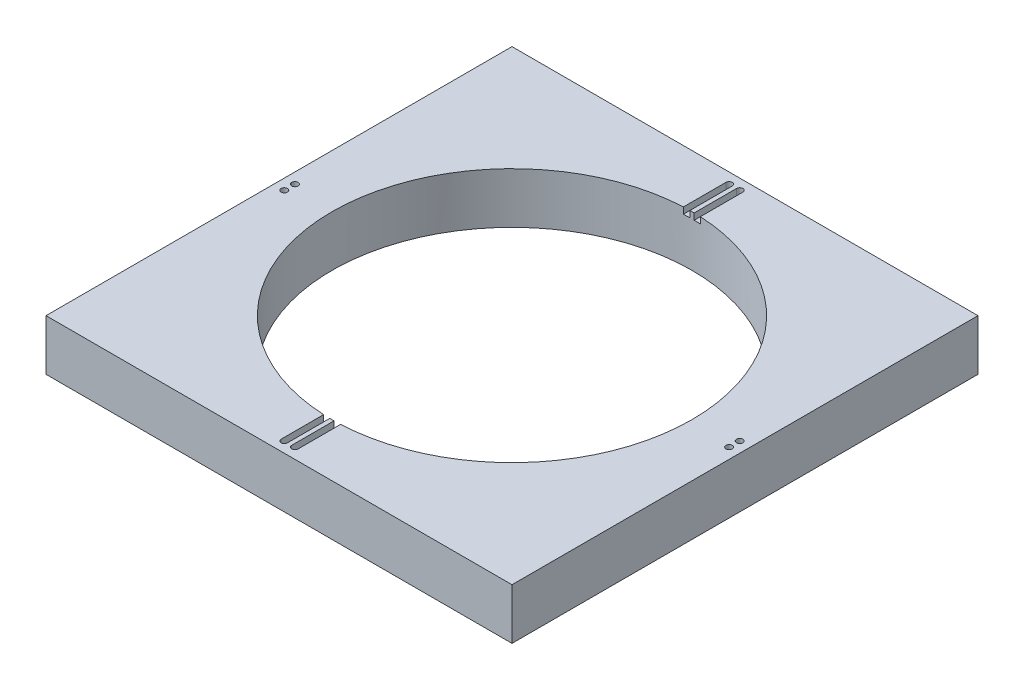
ISO-10303-21;
HEADER;
FILE_DESCRIPTION(('STEP AP214'),'2;1');
FILE_NAME('part.step','',(''),(''),'','','');
FILE_SCHEMA(('AUTOMOTIVE_DESIGN { 1 0 10303 214 1 1 1 1 }'));
ENDSEC;
DATA;
#1=APPLICATION_CONTEXT('core data for automotive mechanical design processes');
#2=APPLICATION_PROTOCOL_DEFINITION('international standard','automotive_design',2000,#1);
#3=PRODUCT_CONTEXT('',#1,'mechanical');
#4=PRODUCT('Part','Part','',(#3));
#5=PRODUCT_RELATED_PRODUCT_CATEGORY('part','',(#4));
#6=PRODUCT_DEFINITION_FORMATION('','',#4);
#7=PRODUCT_DEFINITION_CONTEXT('part definition',#1,'design');
#8=PRODUCT_DEFINITION('design','',#6,#7);
#9=PRODUCT_DEFINITION_SHAPE('','',#8);
#10=(LENGTH_UNIT() NAMED_UNIT(*) SI_UNIT(.MILLI.,.METRE.));
#11=(NAMED_UNIT(*) PLANE_ANGLE_UNIT() SI_UNIT($,.RADIAN.));
#12=(NAMED_UNIT(*) SI_UNIT($,.STERADIAN.) SOLID_ANGLE_UNIT());
#13=UNCERTAINTY_MEASURE_WITH_UNIT(LENGTH_MEASURE(1.E-05),#10,'distance_accuracy_value','');
#14=(GEOMETRIC_REPRESENTATION_CONTEXT(3) GLOBAL_UNCERTAINTY_ASSIGNED_CONTEXT((#13)) GLOBAL_UNIT_ASSIGNED_CONTEXT((#10,
#11,#12)) REPRESENTATION_CONTEXT('',''));
#15=CARTESIAN_POINT('',(0.,0.,0.));
#16=DIRECTION('',(0.,0.,1.));
#17=DIRECTION('',(1.,0.,0.));
#18=AXIS2_PLACEMENT_3D('',#15,#16,#17);
#19=CARTESIAN_POINT('',(-2.5,24.,105.));
#20=DIRECTION('',(0.,-1.,0.));
#21=DIRECTION('',(0.,0.,-1.));
#22=AXIS2_PLACEMENT_3D('',#19,#20,#21);
#23=CYLINDRICAL_SURFACE('',#22,1.5);
#24=CARTESIAN_POINT('',(-2.5,0.,105.));
#25=DIRECTION('',(0.,1.,0.));
#26=DIRECTION('',(0.,0.,1.));
#27=AXIS2_PLACEMENT_3D('',#24,#25,#26);
#28=CIRCLE('',#27,1.5);
#29=CARTESIAN_POINT('',(-2.5,0.,106.5));
#30=VERTEX_POINT('',#29);
#31=EDGE_CURVE('E280',#30,#30,#28,.T.);
#32=ORIENTED_EDGE('',*,*,#31,.F.);
#33=EDGE_LOOP('',(#32));
#34=FACE_BOUND('',#33,.T.);
#35=CARTESIAN_POINT('',(-2.5,21.,105.));
#36=DIRECTION('',(0.,1.,0.));
#37=DIRECTION('',(0.,0.,1.));
#38=AXIS2_PLACEMENT_3D('',#35,#36,#37);
#39=CIRCLE('',#38,1.5);
#40=CARTESIAN_POINT('',(-0.999999999999998,21.,105.));
#41=VERTEX_POINT('',#40);
#42=CARTESIAN_POINT('',(-4.,21.,105.));
#43=VERTEX_POINT('',#42);
#44=EDGE_CURVE('E251',#41,#43,#39,.T.);
#45=ORIENTED_EDGE('',*,*,#44,.T.);
#46=DIRECTION('',(0.,1.,0.));
#47=VECTOR('',#46,1.);
#48=CARTESIAN_POINT('',(-4.,21.,105.));
#49=LINE('',#48,#47);
#50=CARTESIAN_POINT('',(-4.,24.,105.));
#51=VERTEX_POINT('',#50);
#52=EDGE_CURVE('E57',#43,#51,#49,.T.);
#53=ORIENTED_EDGE('',*,*,#52,.T.);
#54=CARTESIAN_POINT('',(-2.5,24.,105.));
#55=DIRECTION('',(0.,1.,0.));
#56=DIRECTION('',(0.,0.,1.));
#57=AXIS2_PLACEMENT_3D('',#54,#55,#56);
#58=CIRCLE('',#57,1.5);
#59=CARTESIAN_POINT('',(-0.999999999999998,24.,105.));
#60=VERTEX_POINT('',#59);
#61=EDGE_CURVE('E283',#51,#60,#58,.T.);
#62=ORIENTED_EDGE('',*,*,#61,.T.);
#63=DIRECTION('',(0.,1.,0.));
#64=VECTOR('',#63,1.);
#65=CARTESIAN_POINT('',(-0.999999999999998,21.,105.));
#66=LINE('',#65,#64);
#67=EDGE_CURVE('E233',#41,#60,#66,.T.);
#68=ORIENTED_EDGE('',*,*,#67,.F.);
#69=EDGE_LOOP('',(#45,#53,#62,#68));
#70=FACE_BOUND('',#69,.T.);
#71=ADVANCED_FACE('F42',(#34,#70),#23,.F.);
#72=CARTESIAN_POINT('',(2.5,24.,105.));
#73=DIRECTION('',(0.,-1.,0.));
#74=DIRECTION('',(0.,0.,-1.));
#75=AXIS2_PLACEMENT_3D('',#72,#73,#74);
#76=CYLINDRICAL_SURFACE('',#75,1.5);
#77=CARTESIAN_POINT('',(2.5,0.,105.));
#78=DIRECTION('',(0.,1.,0.));
#79=DIRECTION('',(0.,0.,1.));
#80=AXIS2_PLACEMENT_3D('',#77,#78,#79);
#81=CIRCLE('',#80,1.5);
#82=CARTESIAN_POINT('',(2.5,0.,106.5));
#83=VERTEX_POINT('',#82);
#84=EDGE_CURVE('E274',#83,#83,#81,.T.);
#85=ORIENTED_EDGE('',*,*,#84,.F.);
#86=EDGE_LOOP('',(#85));
#87=FACE_BOUND('',#86,.T.);
#88=CARTESIAN_POINT('',(2.5,21.,105.));
#89=DIRECTION('',(0.,1.,0.));
#90=DIRECTION('',(0.,0.,1.));
#91=AXIS2_PLACEMENT_3D('',#88,#89,#90);
#92=CIRCLE('',#91,1.5);
#93=CARTESIAN_POINT('',(4.,21.,105.));
#94=VERTEX_POINT('',#93);
#95=CARTESIAN_POINT('',(0.999999999999999,21.,105.));
#96=VERTEX_POINT('',#95);
#97=EDGE_CURVE('E237',#94,#96,#92,.T.);
#98=ORIENTED_EDGE('',*,*,#97,.T.);
#99=DIRECTION('',(0.,1.,0.));
#100=VECTOR('',#99,1.);
#101=CARTESIAN_POINT('',(0.999999999999999,21.,105.));
#102=LINE('',#101,#100);
#103=CARTESIAN_POINT('',(0.999999999999999,24.,105.));
#104=VERTEX_POINT('',#103);
#105=EDGE_CURVE('E65',#96,#104,#102,.T.);
#106=ORIENTED_EDGE('',*,*,#105,.T.);
#107=CARTESIAN_POINT('',(2.5,24.,105.));
#108=DIRECTION('',(0.,1.,0.));
#109=DIRECTION('',(0.,0.,1.));
#110=AXIS2_PLACEMENT_3D('',#107,#108,#109);
#111=CIRCLE('',#110,1.5);
#112=CARTESIAN_POINT('',(4.,24.,105.));
#113=VERTEX_POINT('',#112);
#114=EDGE_CURVE('E277',#104,#113,#111,.T.);
#115=ORIENTED_EDGE('',*,*,#114,.T.);
#116=DIRECTION('',(0.,1.,0.));
#117=VECTOR('',#116,1.);
#118=CARTESIAN_POINT('',(4.,21.,105.));
#119=LINE('',#118,#117);
#120=EDGE_CURVE('E208',#94,#113,#119,.T.);
#121=ORIENTED_EDGE('',*,*,#120,.F.);
#122=EDGE_LOOP('',(#98,#106,#115,#121));
#123=FACE_BOUND('',#122,.T.);
#124=ADVANCED_FACE('F374',(#87,#123),#76,.F.);
#125=CARTESIAN_POINT('',(0.,24.,0.));
#126=DIRECTION('',(0.,-1.,0.));
#127=DIRECTION('',(0.,0.,-1.));
#128=AXIS2_PLACEMENT_3D('',#125,#126,#127);
#129=PLANE('',#128);
#130=DIRECTION('',(0.,0.,-1.));
#131=VECTOR('',#130,1.);
#132=CARTESIAN_POINT('',(110.,24.,110.));
#133=LINE('',#132,#131);
#134=CARTESIAN_POINT('',(110.,24.,110.));
#135=VERTEX_POINT('',#134);
#136=CARTESIAN_POINT('',(110.,24.,-110.));
#137=VERTEX_POINT('',#136);
#138=EDGE_CURVE('E321',#135,#137,#133,.T.);
#139=ORIENTED_EDGE('',*,*,#138,.T.);
#140=DIRECTION('',(-1.,0.,0.));
#141=VECTOR('',#140,1.);
#142=CARTESIAN_POINT('',(-110.,24.,-110.));
#143=LINE('',#142,#141);
#144=CARTESIAN_POINT('',(-110.,24.,-110.));
#145=VERTEX_POINT('',#144);
#146=EDGE_CURVE('E324',#137,#145,#143,.T.);
#147=ORIENTED_EDGE('',*,*,#146,.T.);
#148=DIRECTION('',(0.,0.,1.));
#149=VECTOR('',#148,1.);
#150=CARTESIAN_POINT('',(-110.,24.,110.));
#151=LINE('',#150,#149);
#152=CARTESIAN_POINT('',(-110.,24.,110.));
#153=VERTEX_POINT('',#152);
#154=EDGE_CURVE('E327',#145,#153,#151,.T.);
#155=ORIENTED_EDGE('',*,*,#154,.T.);
#156=DIRECTION('',(1.,0.,0.));
#157=VECTOR('',#156,1.);
#158=CARTESIAN_POINT('',(-110.,24.,110.));
#159=LINE('',#158,#157);
#160=EDGE_CURVE('E329',#153,#135,#159,.T.);
#161=ORIENTED_EDGE('',*,*,#160,.T.);
#162=EDGE_LOOP('',(#139,#147,#155,#161));
#163=FACE_BOUND('',#162,.T.);
#164=CARTESIAN_POINT('',(-105.,24.,-2.5));
#165=DIRECTION('',(0.,1.,0.));
#166=DIRECTION('',(0.,0.,1.));
#167=AXIS2_PLACEMENT_3D('',#164,#165,#166);
#168=CIRCLE('',#167,1.5);
#169=CARTESIAN_POINT('',(-105.,24.,-1.));
#170=VERTEX_POINT('',#169);
#171=EDGE_CURVE('E307',#170,#170,#168,.T.);
#172=ORIENTED_EDGE('',*,*,#171,.F.);
#173=EDGE_LOOP('',(#172));
#174=FACE_BOUND('',#173,.T.);
#175=CARTESIAN_POINT('',(-105.,24.,2.5));
#176=DIRECTION('',(0.,1.,0.));
#177=DIRECTION('',(0.,0.,1.));
#178=AXIS2_PLACEMENT_3D('',#175,#176,#177);
#179=CIRCLE('',#178,1.5);
#180=CARTESIAN_POINT('',(-105.,24.,4.));
#181=VERTEX_POINT('',#180);
#182=EDGE_CURVE('E301',#181,#181,#179,.T.);
#183=ORIENTED_EDGE('',*,*,#182,.F.);
#184=EDGE_LOOP('',(#183));
#185=FACE_BOUND('',#184,.T.);
#186=CARTESIAN_POINT('',(105.,24.,-2.5));
#187=DIRECTION('',(0.,1.,0.));
#188=DIRECTION('',(0.,0.,1.));
#189=AXIS2_PLACEMENT_3D('',#186,#187,#188);
#190=CIRCLE('',#189,1.5);
#191=CARTESIAN_POINT('',(105.,24.,-1.));
#192=VERTEX_POINT('',#191);
#193=EDGE_CURVE('E295',#192,#192,#190,.T.);
#194=ORIENTED_EDGE('',*,*,#193,.F.);
#195=EDGE_LOOP('',(#194));
#196=FACE_BOUND('',#195,.T.);
#197=CARTESIAN_POINT('',(105.,24.,2.5));
#198=DIRECTION('',(0.,1.,0.));
#199=DIRECTION('',(0.,0.,1.));
#200=AXIS2_PLACEMENT_3D('',#197,#198,#199);
#201=CIRCLE('',#200,1.5);
#202=CARTESIAN_POINT('',(105.,24.,4.));
#203=VERTEX_POINT('',#202);
#204=EDGE_CURVE('E289',#203,#203,#201,.T.);
#205=ORIENTED_EDGE('',*,*,#204,.F.);
#206=EDGE_LOOP('',(#205));
#207=FACE_BOUND('',#206,.T.);
#208=CARTESIAN_POINT('',(2.49999999999997,24.,-105.));
#209=DIRECTION('',(0.,1.,0.));
#210=DIRECTION('',(0.,0.,1.));
#211=AXIS2_PLACEMENT_3D('',#208,#209,#210);
#212=CIRCLE('',#211,1.5);
#213=CARTESIAN_POINT('',(3.99999999999998,24.,-105.));
#214=VERTEX_POINT('',#213);
#215=CARTESIAN_POINT('',(0.999999999999973,24.,-105.));
#216=VERTEX_POINT('',#215);
#217=EDGE_CURVE('E205',#214,#216,#212,.T.);
#218=ORIENTED_EDGE('',*,*,#217,.F.);
#219=DIRECTION('',(0.,0.,-1.));
#220=VECTOR('',#219,1.);
#221=CARTESIAN_POINT('',(3.99999999999998,24.,-105.));
#222=LINE('',#221,#220);
#223=CARTESIAN_POINT('',(3.99999999999998,24.,-84.9058301885095));
#224=VERTEX_POINT('',#223);
#225=EDGE_CURVE('E386',#224,#214,#222,.T.);
#226=ORIENTED_EDGE('',*,*,#225,.F.);
#227=CARTESIAN_POINT('',(0.,24.,0.));
#228=DIRECTION('',(0.,1.,0.));
#229=DIRECTION('',(0.,0.,1.));
#230=AXIS2_PLACEMENT_3D('',#227,#228,#229);
#231=CIRCLE('',#230,85.);
#232=CARTESIAN_POINT('',(4.,24.,84.9058301885095));
#233=VERTEX_POINT('',#232);
#234=EDGE_CURVE('E317',#233,#224,#231,.T.);
#235=ORIENTED_EDGE('',*,*,#234,.F.);
#236=EDGE_CURVE('E394',#113,#233,#222,.T.);
#237=ORIENTED_EDGE('',*,*,#236,.F.);
#238=ORIENTED_EDGE('',*,*,#114,.F.);
#239=DIRECTION('',(0.,0.,1.));
#240=VECTOR('',#239,1.);
#241=CARTESIAN_POINT('',(0.999999999999973,24.,-105.));
#242=LINE('',#241,#240);
#243=CARTESIAN_POINT('',(0.999999999999996,24.,84.9941174435031));
#244=VERTEX_POINT('',#243);
#245=EDGE_CURVE('E232',#244,#104,#242,.T.);
#246=ORIENTED_EDGE('',*,*,#245,.F.);
#247=CARTESIAN_POINT('',(-1.,24.,84.9941174435031));
#248=VERTEX_POINT('',#247);
#249=EDGE_CURVE('E313',#248,#244,#231,.T.);
#250=ORIENTED_EDGE('',*,*,#249,.F.);
#251=DIRECTION('',(0.,0.,-1.));
#252=VECTOR('',#251,1.);
#253=CARTESIAN_POINT('',(-1.00000000000002,24.,-105.));
#254=LINE('',#253,#252);
#255=EDGE_CURVE('E227',#60,#248,#254,.T.);
#256=ORIENTED_EDGE('',*,*,#255,.F.);
#257=ORIENTED_EDGE('',*,*,#61,.F.);
#258=DIRECTION('',(0.,0.,1.));
#259=VECTOR('',#258,1.);
#260=CARTESIAN_POINT('',(-4.00000000000003,24.,-105.));
#261=LINE('',#260,#259);
#262=CARTESIAN_POINT('',(-4.00000000000001,24.,84.9058301885094));
#263=VERTEX_POINT('',#262);
#264=EDGE_CURVE('E226',#263,#51,#261,.T.);
#265=ORIENTED_EDGE('',*,*,#264,.F.);
#266=CARTESIAN_POINT('',(-4.00000000000003,24.,-84.9058301885094));
#267=VERTEX_POINT('',#266);
#268=EDGE_CURVE('E316',#267,#263,#231,.T.);
#269=ORIENTED_EDGE('',*,*,#268,.F.);
#270=CARTESIAN_POINT('',(-4.00000000000003,24.,-105.));
#271=VERTEX_POINT('',#270);
#272=EDGE_CURVE('E223',#271,#267,#261,.T.);
#273=ORIENTED_EDGE('',*,*,#272,.F.);
#274=CARTESIAN_POINT('',(-2.50000000000003,24.,-105.));
#275=DIRECTION('',(0.,1.,0.));
#276=DIRECTION('',(0.,0.,1.));
#277=AXIS2_PLACEMENT_3D('',#274,#275,#276);
#278=CIRCLE('',#277,1.5);
#279=CARTESIAN_POINT('',(-1.00000000000002,24.,-105.));
#280=VERTEX_POINT('',#279);
#281=EDGE_CURVE('E271',#280,#271,#278,.T.);
#282=ORIENTED_EDGE('',*,*,#281,.F.);
#283=CARTESIAN_POINT('',(-1.00000000000002,24.,-84.9941174435031));
#284=VERTEX_POINT('',#283);
#285=EDGE_CURVE('E225',#284,#280,#254,.T.);
#286=ORIENTED_EDGE('',*,*,#285,.F.);
#287=CARTESIAN_POINT('',(0.999999999999975,24.,-84.9941174435031));
#288=VERTEX_POINT('',#287);
#289=EDGE_CURVE('E392',#288,#284,#231,.T.);
#290=ORIENTED_EDGE('',*,*,#289,.F.);
#291=EDGE_CURVE('E389',#216,#288,#242,.T.);
#292=ORIENTED_EDGE('',*,*,#291,.F.);
#293=EDGE_LOOP('',(#218,#226,#235,#237,#238,#246,#250,#256,#257,#265,#269,#273,#282,#286,#290,#292));
#294=FACE_BOUND('',#293,.T.);
#295=ADVANCED_FACE('F371',(#163,#174,#185,#196,#207,#294),#129,.F.);
#296=CARTESIAN_POINT('',(0.,0.,0.));
#297=DIRECTION('',(0.,-1.,0.));
#298=DIRECTION('',(0.,0.,-1.));
#299=AXIS2_PLACEMENT_3D('',#296,#297,#298);
#300=PLANE('',#299);
#301=CARTESIAN_POINT('',(-2.50000000000003,0.,-105.));
#302=DIRECTION('',(0.,1.,0.));
#303=DIRECTION('',(0.,0.,1.));
#304=AXIS2_PLACEMENT_3D('',#301,#302,#303);
#305=CIRCLE('',#304,1.5);
#306=CARTESIAN_POINT('',(-2.50000000000003,0.,-103.5));
#307=VERTEX_POINT('',#306);
#308=EDGE_CURVE('E268',#307,#307,#305,.T.);
#309=ORIENTED_EDGE('',*,*,#308,.T.);
#310=EDGE_LOOP('',(#309));
#311=FACE_BOUND('',#310,.T.);
#312=ORIENTED_EDGE('',*,*,#31,.T.);
#313=EDGE_LOOP('',(#312));
#314=FACE_BOUND('',#313,.T.);
#315=CARTESIAN_POINT('',(105.,0.,-2.5));
#316=DIRECTION('',(0.,1.,0.));
#317=DIRECTION('',(0.,0.,1.));
#318=AXIS2_PLACEMENT_3D('',#315,#316,#317);
#319=CIRCLE('',#318,1.5);
#320=CARTESIAN_POINT('',(105.,0.,-1.));
#321=VERTEX_POINT('',#320);
#322=EDGE_CURVE('E292',#321,#321,#319,.T.);
#323=ORIENTED_EDGE('',*,*,#322,.T.);
#324=EDGE_LOOP('',(#323));
#325=FACE_BOUND('',#324,.T.);
#326=CARTESIAN_POINT('',(-105.,0.,-2.5));
#327=DIRECTION('',(0.,1.,0.));
#328=DIRECTION('',(0.,0.,1.));
#329=AXIS2_PLACEMENT_3D('',#326,#327,#328);
#330=CIRCLE('',#329,1.5);
#331=CARTESIAN_POINT('',(-105.,0.,-1.));
#332=VERTEX_POINT('',#331);
#333=EDGE_CURVE('E304',#332,#332,#330,.T.);
#334=ORIENTED_EDGE('',*,*,#333,.T.);
#335=EDGE_LOOP('',(#334));
#336=FACE_BOUND('',#335,.T.);
#337=DIRECTION('',(0.,0.,-1.));
#338=VECTOR('',#337,1.);
#339=CARTESIAN_POINT('',(110.,0.,110.));
#340=LINE('',#339,#338);
#341=CARTESIAN_POINT('',(110.,0.,110.));
#342=VERTEX_POINT('',#341);
#343=CARTESIAN_POINT('',(110.,0.,-110.));
#344=VERTEX_POINT('',#343);
#345=EDGE_CURVE('E332',#342,#344,#340,.T.);
#346=ORIENTED_EDGE('',*,*,#345,.F.);
#347=DIRECTION('',(1.,0.,0.));
#348=VECTOR('',#347,1.);
#349=CARTESIAN_POINT('',(-110.,0.,110.));
#350=LINE('',#349,#348);
#351=CARTESIAN_POINT('',(-110.,0.,110.));
#352=VERTEX_POINT('',#351);
#353=EDGE_CURVE('E325',#352,#342,#350,.T.);
#354=ORIENTED_EDGE('',*,*,#353,.F.);
#355=DIRECTION('',(0.,0.,1.));
#356=VECTOR('',#355,1.);
#357=CARTESIAN_POINT('',(-110.,0.,110.));
#358=LINE('',#357,#356);
#359=CARTESIAN_POINT('',(-110.,0.,-110.));
#360=VERTEX_POINT('',#359);
#361=EDGE_CURVE('E337',#360,#352,#358,.T.);
#362=ORIENTED_EDGE('',*,*,#361,.F.);
#363=DIRECTION('',(-1.,0.,0.));
#364=VECTOR('',#363,1.);
#365=CARTESIAN_POINT('',(-110.,0.,-110.));
#366=LINE('',#365,#364);
#367=EDGE_CURVE('E335',#344,#360,#366,.T.);
#368=ORIENTED_EDGE('',*,*,#367,.F.);
#369=EDGE_LOOP('',(#346,#354,#362,#368));
#370=FACE_BOUND('',#369,.T.);
#371=CARTESIAN_POINT('',(0.,0.,0.));
#372=DIRECTION('',(0.,1.,0.));
#373=DIRECTION('',(0.,0.,1.));
#374=AXIS2_PLACEMENT_3D('',#371,#372,#373);
#375=CIRCLE('',#374,85.);
#376=CARTESIAN_POINT('',(0.,0.,85.));
#377=VERTEX_POINT('',#376);
#378=EDGE_CURVE('E310',#377,#377,#375,.T.);
#379=ORIENTED_EDGE('',*,*,#378,.T.);
#380=EDGE_LOOP('',(#379));
#381=FACE_BOUND('',#380,.T.);
#382=CARTESIAN_POINT('',(-105.,0.,2.5));
#383=DIRECTION('',(0.,1.,0.));
#384=DIRECTION('',(0.,0.,1.));
#385=AXIS2_PLACEMENT_3D('',#382,#383,#384);
#386=CIRCLE('',#385,1.5);
#387=CARTESIAN_POINT('',(-105.,0.,4.));
#388=VERTEX_POINT('',#387);
#389=EDGE_CURVE('E298',#388,#388,#386,.T.);
#390=ORIENTED_EDGE('',*,*,#389,.T.);
#391=EDGE_LOOP('',(#390));
#392=FACE_BOUND('',#391,.T.);
#393=CARTESIAN_POINT('',(105.,0.,2.5));
#394=DIRECTION('',(0.,1.,0.));
#395=DIRECTION('',(0.,0.,1.));
#396=AXIS2_PLACEMENT_3D('',#393,#394,#395);
#397=CIRCLE('',#396,1.5);
#398=CARTESIAN_POINT('',(105.,0.,4.));
#399=VERTEX_POINT('',#398);
#400=EDGE_CURVE('E286',#399,#399,#397,.T.);
#401=ORIENTED_EDGE('',*,*,#400,.T.);
#402=EDGE_LOOP('',(#401));
#403=FACE_BOUND('',#402,.T.);
#404=ORIENTED_EDGE('',*,*,#84,.T.);
#405=EDGE_LOOP('',(#404));
#406=FACE_BOUND('',#405,.T.);
#407=CARTESIAN_POINT('',(2.49999999999997,0.,-105.));
#408=DIRECTION('',(0.,1.,0.));
#409=DIRECTION('',(0.,0.,1.));
#410=AXIS2_PLACEMENT_3D('',#407,#408,#409);
#411=CIRCLE('',#410,1.5);
#412=CARTESIAN_POINT('',(2.49999999999997,0.,-103.5));
#413=VERTEX_POINT('',#412);
#414=EDGE_CURVE('E266',#413,#413,#411,.T.);
#415=ORIENTED_EDGE('',*,*,#414,.T.);
#416=EDGE_LOOP('',(#415));
#417=FACE_BOUND('',#416,.T.);
#418=ADVANCED_FACE('F360',(#311,#314,#325,#336,#370,#381,#392,#403,#406,#417),#300,.T.);
#419=CARTESIAN_POINT('',(110.,24.,110.));
#420=DIRECTION('',(-1.,0.,0.));
#421=DIRECTION('',(0.,0.,1.));
#422=AXIS2_PLACEMENT_3D('',#419,#420,#421);
#423=PLANE('',#422);
#424=ORIENTED_EDGE('',*,*,#345,.T.);
#425=DIRECTION('',(0.,-1.,0.));
#426=VECTOR('',#425,1.);
#427=CARTESIAN_POINT('',(110.,24.,-110.));
#428=LINE('',#427,#426);
#429=EDGE_CURVE('E192',#137,#344,#428,.T.);
#430=ORIENTED_EDGE('',*,*,#429,.F.);
#431=ORIENTED_EDGE('',*,*,#138,.F.);
#432=DIRECTION('',(0.,-1.,0.));
#433=VECTOR('',#432,1.);
#434=CARTESIAN_POINT('',(110.,24.,110.));
#435=LINE('',#434,#433);
#436=EDGE_CURVE('E331',#135,#342,#435,.T.);
#437=ORIENTED_EDGE('',*,*,#436,.T.);
#438=EDGE_LOOP('',(#424,#430,#431,#437));
#439=FACE_BOUND('',#438,.T.);
#440=ADVANCED_FACE('F44',(#439),#423,.F.);
#441=CARTESIAN_POINT('',(-110.,24.,-110.));
#442=DIRECTION('',(0.,0.,1.));
#443=DIRECTION('',(1.,0.,0.));
#444=AXIS2_PLACEMENT_3D('',#441,#442,#443);
#445=PLANE('',#444);
#446=ORIENTED_EDGE('',*,*,#367,.T.);
#447=DIRECTION('',(0.,-1.,0.));
#448=VECTOR('',#447,1.);
#449=CARTESIAN_POINT('',(-110.,24.,-110.));
#450=LINE('',#449,#448);
#451=EDGE_CURVE('E346',#145,#360,#450,.T.);
#452=ORIENTED_EDGE('',*,*,#451,.F.);
#453=ORIENTED_EDGE('',*,*,#146,.F.);
#454=ORIENTED_EDGE('',*,*,#429,.T.);
#455=EDGE_LOOP('',(#446,#452,#453,#454));
#456=FACE_BOUND('',#455,.T.);
#457=ADVANCED_FACE('F352',(#456),#445,.F.);
#458=CARTESIAN_POINT('',(-110.,24.,110.));
#459=DIRECTION('',(1.,0.,0.));
#460=DIRECTION('',(0.,0.,-1.));
#461=AXIS2_PLACEMENT_3D('',#458,#459,#460);
#462=PLANE('',#461);
#463=ORIENTED_EDGE('',*,*,#361,.T.);
#464=DIRECTION('',(0.,-1.,0.));
#465=VECTOR('',#464,1.);
#466=CARTESIAN_POINT('',(-110.,24.,110.));
#467=LINE('',#466,#465);
#468=EDGE_CURVE('E341',#153,#352,#467,.T.);
#469=ORIENTED_EDGE('',*,*,#468,.F.);
#470=ORIENTED_EDGE('',*,*,#154,.F.);
#471=ORIENTED_EDGE('',*,*,#451,.T.);
#472=EDGE_LOOP('',(#463,#469,#470,#471));
#473=FACE_BOUND('',#472,.T.);
#474=ADVANCED_FACE('F365',(#473),#462,.F.);
#475=CARTESIAN_POINT('',(-110.,24.,110.));
#476=DIRECTION('',(0.,0.,-1.));
#477=DIRECTION('',(-1.,0.,0.));
#478=AXIS2_PLACEMENT_3D('',#475,#476,#477);
#479=PLANE('',#478);
#480=ORIENTED_EDGE('',*,*,#353,.T.);
#481=ORIENTED_EDGE('',*,*,#436,.F.);
#482=ORIENTED_EDGE('',*,*,#160,.F.);
#483=ORIENTED_EDGE('',*,*,#468,.T.);
#484=EDGE_LOOP('',(#480,#481,#482,#483));
#485=FACE_BOUND('',#484,.T.);
#486=ADVANCED_FACE('F369',(#485),#479,.F.);
#487=CARTESIAN_POINT('',(0.,24.,0.));
#488=DIRECTION('',(0.,-1.,0.));
#489=DIRECTION('',(0.,0.,-1.));
#490=AXIS2_PLACEMENT_3D('',#487,#488,#489);
#491=CYLINDRICAL_SURFACE('',#490,85.);
#492=DIRECTION('',(0.,-1.,0.));
#493=VECTOR('',#492,1.);
#494=CARTESIAN_POINT('',(4.,24.,84.9058301885095));
#495=LINE('',#494,#493);
#496=CARTESIAN_POINT('',(4.,21.,84.9058301885095));
#497=VERTEX_POINT('',#496);
#498=EDGE_CURVE('E249',#233,#497,#495,.T.);
#499=ORIENTED_EDGE('',*,*,#498,.F.);
#500=ORIENTED_EDGE('',*,*,#234,.T.);
#501=DIRECTION('',(0.,-1.,0.));
#502=VECTOR('',#501,1.);
#503=CARTESIAN_POINT('',(3.99999999999998,24.,-84.9058301885095));
#504=LINE('',#503,#502);
#505=CARTESIAN_POINT('',(3.99999999999998,21.,-84.9058301885095));
#506=VERTEX_POINT('',#505);
#507=EDGE_CURVE('E247',#506,#224,#504,.F.);
#508=ORIENTED_EDGE('',*,*,#507,.F.);
#509=CARTESIAN_POINT('',(0.,21.,0.));
#510=DIRECTION('',(0.,1.,0.));
#511=DIRECTION('',(0.,0.,1.));
#512=AXIS2_PLACEMENT_3D('',#509,#510,#511);
#513=CIRCLE('',#512,85.);
#514=CARTESIAN_POINT('',(0.999999999999975,21.,-84.9941174435031));
#515=VERTEX_POINT('',#514);
#516=EDGE_CURVE('E240',#506,#515,#513,.T.);
#517=ORIENTED_EDGE('',*,*,#516,.T.);
#518=DIRECTION('',(0.,-1.,0.));
#519=VECTOR('',#518,1.);
#520=CARTESIAN_POINT('',(0.999999999999975,24.,-84.9941174435031));
#521=LINE('',#520,#519);
#522=EDGE_CURVE('E198',#288,#515,#521,.T.);
#523=ORIENTED_EDGE('',*,*,#522,.F.);
#524=ORIENTED_EDGE('',*,*,#289,.T.);
#525=DIRECTION('',(0.,-1.,0.));
#526=VECTOR('',#525,1.);
#527=CARTESIAN_POINT('',(-1.00000000000002,24.,-84.9941174435031));
#528=LINE('',#527,#526);
#529=CARTESIAN_POINT('',(-1.00000000000002,21.,-84.9941174435031));
#530=VERTEX_POINT('',#529);
#531=EDGE_CURVE('E262',#530,#284,#528,.F.);
#532=ORIENTED_EDGE('',*,*,#531,.F.);
#533=CARTESIAN_POINT('',(0.,21.,0.));
#534=DIRECTION('',(0.,1.,0.));
#535=DIRECTION('',(0.,0.,1.));
#536=AXIS2_PLACEMENT_3D('',#533,#534,#535);
#537=CIRCLE('',#536,85.);
#538=CARTESIAN_POINT('',(-4.00000000000003,21.,-84.9058301885094));
#539=VERTEX_POINT('',#538);
#540=EDGE_CURVE('E257',#530,#539,#537,.T.);
#541=ORIENTED_EDGE('',*,*,#540,.T.);
#542=DIRECTION('',(0.,-1.,0.));
#543=VECTOR('',#542,1.);
#544=CARTESIAN_POINT('',(-4.00000000000003,24.,-84.9058301885094));
#545=LINE('',#544,#543);
#546=EDGE_CURVE('E260',#267,#539,#545,.T.);
#547=ORIENTED_EDGE('',*,*,#546,.F.);
#548=ORIENTED_EDGE('',*,*,#268,.T.);
#549=DIRECTION('',(0.,-1.,0.));
#550=VECTOR('',#549,1.);
#551=CARTESIAN_POINT('',(-4.00000000000001,24.,84.9058301885094));
#552=LINE('',#551,#550);
#553=CARTESIAN_POINT('',(-4.00000000000001,21.,84.9058301885094));
#554=VERTEX_POINT('',#553);
#555=EDGE_CURVE('E258',#554,#263,#552,.F.);
#556=ORIENTED_EDGE('',*,*,#555,.F.);
#557=CARTESIAN_POINT('',(-1.,21.,84.9941174435031));
#558=VERTEX_POINT('',#557);
#559=EDGE_CURVE('E254',#554,#558,#537,.T.);
#560=ORIENTED_EDGE('',*,*,#559,.T.);
#561=DIRECTION('',(0.,-1.,0.));
#562=VECTOR('',#561,1.);
#563=CARTESIAN_POINT('',(-1.,24.,84.9941174435031));
#564=LINE('',#563,#562);
#565=EDGE_CURVE('E264',#248,#558,#564,.T.);
#566=ORIENTED_EDGE('',*,*,#565,.F.);
#567=ORIENTED_EDGE('',*,*,#249,.T.);
#568=DIRECTION('',(0.,-1.,0.));
#569=VECTOR('',#568,1.);
#570=CARTESIAN_POINT('',(0.999999999999996,24.,84.9941174435031));
#571=LINE('',#570,#569);
#572=CARTESIAN_POINT('',(0.999999999999996,21.,84.9941174435031));
#573=VERTEX_POINT('',#572);
#574=EDGE_CURVE('E244',#573,#244,#571,.F.);
#575=ORIENTED_EDGE('',*,*,#574,.F.);
#576=EDGE_CURVE('E243',#573,#497,#513,.T.);
#577=ORIENTED_EDGE('',*,*,#576,.T.);
#578=EDGE_LOOP('',(#499,#500,#508,#517,#523,#524,#532,#541,#547,#548,#556,#560,#566,#567,#575,#577));
#579=FACE_BOUND('',#578,.T.);
#580=ORIENTED_EDGE('',*,*,#378,.F.);
#581=EDGE_LOOP('',(#580));
#582=FACE_BOUND('',#581,.T.);
#583=ADVANCED_FACE('F420',(#579,#582),#491,.F.);
#584=CARTESIAN_POINT('',(-105.,24.,-2.5));
#585=DIRECTION('',(0.,-1.,0.));
#586=DIRECTION('',(0.,0.,-1.));
#587=AXIS2_PLACEMENT_3D('',#584,#585,#586);
#588=CYLINDRICAL_SURFACE('',#587,1.5);
#589=ORIENTED_EDGE('',*,*,#171,.T.);
#590=EDGE_LOOP('',(#589));
#591=FACE_BOUND('',#590,.T.);
#592=ORIENTED_EDGE('',*,*,#333,.F.);
#593=EDGE_LOOP('',(#592));
#594=FACE_BOUND('',#593,.T.);
#595=ADVANCED_FACE('F424',(#591,#594),#588,.F.);
#596=CARTESIAN_POINT('',(-105.,24.,2.5));
#597=DIRECTION('',(0.,-1.,0.));
#598=DIRECTION('',(0.,0.,-1.));
#599=AXIS2_PLACEMENT_3D('',#596,#597,#598);
#600=CYLINDRICAL_SURFACE('',#599,1.5);
#601=ORIENTED_EDGE('',*,*,#182,.T.);
#602=EDGE_LOOP('',(#601));
#603=FACE_BOUND('',#602,.T.);
#604=ORIENTED_EDGE('',*,*,#389,.F.);
#605=EDGE_LOOP('',(#604));
#606=FACE_BOUND('',#605,.T.);
#607=ADVANCED_FACE('F440',(#603,#606),#600,.F.);
#608=CARTESIAN_POINT('',(105.,24.,-2.5));
#609=DIRECTION('',(0.,-1.,0.));
#610=DIRECTION('',(0.,0.,-1.));
#611=AXIS2_PLACEMENT_3D('',#608,#609,#610);
#612=CYLINDRICAL_SURFACE('',#611,1.5);
#613=ORIENTED_EDGE('',*,*,#193,.T.);
#614=EDGE_LOOP('',(#613));
#615=FACE_BOUND('',#614,.T.);
#616=ORIENTED_EDGE('',*,*,#322,.F.);
#617=EDGE_LOOP('',(#616));
#618=FACE_BOUND('',#617,.T.);
#619=ADVANCED_FACE('F447',(#615,#618),#612,.F.);
#620=CARTESIAN_POINT('',(105.,24.,2.5));
#621=DIRECTION('',(0.,-1.,0.));
#622=DIRECTION('',(0.,0.,-1.));
#623=AXIS2_PLACEMENT_3D('',#620,#621,#622);
#624=CYLINDRICAL_SURFACE('',#623,1.5);
#625=ORIENTED_EDGE('',*,*,#204,.T.);
#626=EDGE_LOOP('',(#625));
#627=FACE_BOUND('',#626,.T.);
#628=ORIENTED_EDGE('',*,*,#400,.F.);
#629=EDGE_LOOP('',(#628));
#630=FACE_BOUND('',#629,.T.);
#631=ADVANCED_FACE('F455',(#627,#630),#624,.F.);
#632=CARTESIAN_POINT('',(-2.50000000000003,24.,-105.));
#633=DIRECTION('',(0.,-1.,0.));
#634=DIRECTION('',(0.,0.,-1.));
#635=AXIS2_PLACEMENT_3D('',#632,#633,#634);
#636=CYLINDRICAL_SURFACE('',#635,1.5);
#637=DIRECTION('',(0.,1.,0.));
#638=VECTOR('',#637,1.);
#639=CARTESIAN_POINT('',(-1.00000000000002,21.,-105.));
#640=LINE('',#639,#638);
#641=CARTESIAN_POINT('',(-1.00000000000003,21.,-105.));
#642=VERTEX_POINT('',#641);
#643=EDGE_CURVE('E229',#642,#280,#640,.T.);
#644=ORIENTED_EDGE('',*,*,#643,.T.);
#645=ORIENTED_EDGE('',*,*,#281,.T.);
#646=DIRECTION('',(0.,1.,0.));
#647=VECTOR('',#646,1.);
#648=CARTESIAN_POINT('',(-4.00000000000003,21.,-105.));
#649=LINE('',#648,#647);
#650=CARTESIAN_POINT('',(-4.00000000000003,21.,-105.));
#651=VERTEX_POINT('',#650);
#652=EDGE_CURVE('E222',#651,#271,#649,.T.);
#653=ORIENTED_EDGE('',*,*,#652,.F.);
#654=CARTESIAN_POINT('',(-2.50000000000003,21.,-105.));
#655=DIRECTION('',(0.,1.,0.));
#656=DIRECTION('',(0.,0.,1.));
#657=AXIS2_PLACEMENT_3D('',#654,#655,#656);
#658=CIRCLE('',#657,1.5);
#659=EDGE_CURVE('E12',#651,#642,#658,.T.);
#660=ORIENTED_EDGE('',*,*,#659,.T.);
#661=EDGE_LOOP('',(#644,#645,#653,#660));
#662=FACE_BOUND('',#661,.T.);
#663=ORIENTED_EDGE('',*,*,#308,.F.);
#664=EDGE_LOOP('',(#663));
#665=FACE_BOUND('',#664,.T.);
#666=ADVANCED_FACE('F463',(#662,#665),#636,.F.);
#667=CARTESIAN_POINT('',(2.49999999999997,24.,-105.));
#668=DIRECTION('',(0.,-1.,0.));
#669=DIRECTION('',(0.,0.,-1.));
#670=AXIS2_PLACEMENT_3D('',#667,#668,#669);
#671=CYLINDRICAL_SURFACE('',#670,1.5);
#672=DIRECTION('',(0.,1.,0.));
#673=VECTOR('',#672,1.);
#674=CARTESIAN_POINT('',(3.99999999999998,21.,-105.));
#675=LINE('',#674,#673);
#676=CARTESIAN_POINT('',(3.99999999999997,21.,-105.));
#677=VERTEX_POINT('',#676);
#678=EDGE_CURVE('E241',#677,#214,#675,.T.);
#679=ORIENTED_EDGE('',*,*,#678,.T.);
#680=ORIENTED_EDGE('',*,*,#217,.T.);
#681=DIRECTION('',(0.,1.,0.));
#682=VECTOR('',#681,1.);
#683=CARTESIAN_POINT('',(0.999999999999973,21.,-105.));
#684=LINE('',#683,#682);
#685=CARTESIAN_POINT('',(0.999999999999973,21.,-105.));
#686=VERTEX_POINT('',#685);
#687=EDGE_CURVE('E195',#686,#216,#684,.T.);
#688=ORIENTED_EDGE('',*,*,#687,.F.);
#689=CARTESIAN_POINT('',(2.49999999999997,21.,-105.));
#690=DIRECTION('',(0.,1.,0.));
#691=DIRECTION('',(0.,0.,1.));
#692=AXIS2_PLACEMENT_3D('',#689,#690,#691);
#693=CIRCLE('',#692,1.5);
#694=EDGE_CURVE('E50',#686,#677,#693,.T.);
#695=ORIENTED_EDGE('',*,*,#694,.T.);
#696=EDGE_LOOP('',(#679,#680,#688,#695));
#697=FACE_BOUND('',#696,.T.);
#698=ORIENTED_EDGE('',*,*,#414,.F.);
#699=EDGE_LOOP('',(#698));
#700=FACE_BOUND('',#699,.T.);
#701=ADVANCED_FACE('F202',(#697,#700),#671,.F.);
#702=CARTESIAN_POINT('',(2.49999999999997,21.,-105.));
#703=DIRECTION('',(0.,1.,0.));
#704=DIRECTION('',(0.,0.,1.));
#705=AXIS2_PLACEMENT_3D('',#702,#703,#704);
#706=PLANE('',#705);
#707=DIRECTION('',(0.,0.,-1.));
#708=VECTOR('',#707,1.);
#709=CARTESIAN_POINT('',(3.99999999999998,21.,-105.));
#710=LINE('',#709,#708);
#711=EDGE_CURVE('E188',#506,#677,#710,.T.);
#712=ORIENTED_EDGE('',*,*,#711,.T.);
#713=ORIENTED_EDGE('',*,*,#694,.F.);
#714=DIRECTION('',(0.,0.,1.));
#715=VECTOR('',#714,1.);
#716=CARTESIAN_POINT('',(0.999999999999973,21.,-105.));
#717=LINE('',#716,#715);
#718=EDGE_CURVE('E185',#686,#515,#717,.T.);
#719=ORIENTED_EDGE('',*,*,#718,.T.);
#720=ORIENTED_EDGE('',*,*,#516,.F.);
#721=EDGE_LOOP('',(#712,#713,#719,#720));
#722=FACE_BOUND('',#721,.T.);
#723=ADVANCED_FACE('F184',(#722),#706,.T.);
#724=CARTESIAN_POINT('',(0.999999999999973,21.,-105.));
#725=DIRECTION('',(-1.,0.,0.));
#726=DIRECTION('',(0.,0.,1.));
#727=AXIS2_PLACEMENT_3D('',#724,#725,#726);
#728=PLANE('',#727);
#729=ORIENTED_EDGE('',*,*,#522,.T.);
#730=ORIENTED_EDGE('',*,*,#718,.F.);
#731=ORIENTED_EDGE('',*,*,#687,.T.);
#732=ORIENTED_EDGE('',*,*,#291,.T.);
#733=EDGE_LOOP('',(#729,#730,#731,#732));
#734=FACE_BOUND('',#733,.T.);
#735=ADVANCED_FACE('F194',(#734),#728,.F.);
#736=CARTESIAN_POINT('',(3.99999999999998,21.,-105.));
#737=DIRECTION('',(1.,0.,0.));
#738=DIRECTION('',(0.,0.,-1.));
#739=AXIS2_PLACEMENT_3D('',#736,#737,#738);
#740=PLANE('',#739);
#741=ORIENTED_EDGE('',*,*,#507,.T.);
#742=ORIENTED_EDGE('',*,*,#225,.T.);
#743=ORIENTED_EDGE('',*,*,#678,.F.);
#744=ORIENTED_EDGE('',*,*,#711,.F.);
#745=EDGE_LOOP('',(#741,#742,#743,#744));
#746=FACE_BOUND('',#745,.T.);
#747=ADVANCED_FACE('F487',(#746),#740,.F.);
#748=CARTESIAN_POINT('',(-2.50000000000003,21.,-105.));
#749=DIRECTION('',(0.,1.,0.));
#750=DIRECTION('',(0.,0.,1.));
#751=AXIS2_PLACEMENT_3D('',#748,#749,#750);
#752=PLANE('',#751);
#753=DIRECTION('',(0.,0.,-1.));
#754=VECTOR('',#753,1.);
#755=CARTESIAN_POINT('',(-1.00000000000002,21.,-105.));
#756=LINE('',#755,#754);
#757=EDGE_CURVE('E217',#530,#642,#756,.T.);
#758=ORIENTED_EDGE('',*,*,#757,.T.);
#759=ORIENTED_EDGE('',*,*,#659,.F.);
#760=DIRECTION('',(0.,0.,1.));
#761=VECTOR('',#760,1.);
#762=CARTESIAN_POINT('',(-4.00000000000003,21.,-105.));
#763=LINE('',#762,#761);
#764=EDGE_CURVE('E214',#651,#539,#763,.T.);
#765=ORIENTED_EDGE('',*,*,#764,.T.);
#766=ORIENTED_EDGE('',*,*,#540,.F.);
#767=EDGE_LOOP('',(#758,#759,#765,#766));
#768=FACE_BOUND('',#767,.T.);
#769=ADVANCED_FACE('F495',(#768),#752,.T.);
#770=CARTESIAN_POINT('',(-4.00000000000003,21.,-105.));
#771=DIRECTION('',(-1.,0.,0.));
#772=DIRECTION('',(0.,0.,1.));
#773=AXIS2_PLACEMENT_3D('',#770,#771,#772);
#774=PLANE('',#773);
#775=ORIENTED_EDGE('',*,*,#546,.T.);
#776=ORIENTED_EDGE('',*,*,#764,.F.);
#777=ORIENTED_EDGE('',*,*,#652,.T.);
#778=ORIENTED_EDGE('',*,*,#272,.T.);
#779=EDGE_LOOP('',(#775,#776,#777,#778));
#780=FACE_BOUND('',#779,.T.);
#781=ADVANCED_FACE('F503',(#780),#774,.F.);
#782=CARTESIAN_POINT('',(-1.00000000000002,21.,-105.));
#783=DIRECTION('',(1.,0.,0.));
#784=DIRECTION('',(0.,0.,-1.));
#785=AXIS2_PLACEMENT_3D('',#782,#783,#784);
#786=PLANE('',#785);
#787=ORIENTED_EDGE('',*,*,#531,.T.);
#788=ORIENTED_EDGE('',*,*,#285,.T.);
#789=ORIENTED_EDGE('',*,*,#643,.F.);
#790=ORIENTED_EDGE('',*,*,#757,.F.);
#791=EDGE_LOOP('',(#787,#788,#789,#790));
#792=FACE_BOUND('',#791,.T.);
#793=ADVANCED_FACE('F512',(#792),#786,.F.);
#794=ORIENTED_EDGE('',*,*,#498,.T.);
#795=EDGE_CURVE('E206',#94,#497,#710,.T.);
#796=ORIENTED_EDGE('',*,*,#795,.F.);
#797=ORIENTED_EDGE('',*,*,#120,.T.);
#798=ORIENTED_EDGE('',*,*,#236,.T.);
#799=EDGE_LOOP('',(#794,#796,#797,#798));
#800=FACE_BOUND('',#799,.T.);
#801=ADVANCED_FACE('F401',(#800),#740,.F.);
#802=EDGE_CURVE('E199',#573,#96,#717,.T.);
#803=ORIENTED_EDGE('',*,*,#802,.T.);
#804=ORIENTED_EDGE('',*,*,#97,.F.);
#805=ORIENTED_EDGE('',*,*,#795,.T.);
#806=ORIENTED_EDGE('',*,*,#576,.F.);
#807=EDGE_LOOP('',(#803,#804,#805,#806));
#808=FACE_BOUND('',#807,.T.);
#809=ADVANCED_FACE('F407',(#808),#706,.T.);
#810=ORIENTED_EDGE('',*,*,#574,.T.);
#811=ORIENTED_EDGE('',*,*,#245,.T.);
#812=ORIENTED_EDGE('',*,*,#105,.F.);
#813=ORIENTED_EDGE('',*,*,#802,.F.);
#814=EDGE_LOOP('',(#810,#811,#812,#813));
#815=FACE_BOUND('',#814,.T.);
#816=ADVANCED_FACE('F489',(#815),#728,.F.);
#817=ORIENTED_EDGE('',*,*,#565,.T.);
#818=EDGE_CURVE('E219',#41,#558,#756,.T.);
#819=ORIENTED_EDGE('',*,*,#818,.F.);
#820=ORIENTED_EDGE('',*,*,#67,.T.);
#821=ORIENTED_EDGE('',*,*,#255,.T.);
#822=EDGE_LOOP('',(#817,#819,#820,#821));
#823=FACE_BOUND('',#822,.T.);
#824=ADVANCED_FACE('F523',(#823),#786,.F.);
#825=ORIENTED_EDGE('',*,*,#555,.T.);
#826=ORIENTED_EDGE('',*,*,#264,.T.);
#827=ORIENTED_EDGE('',*,*,#52,.F.);
#828=EDGE_CURVE('E218',#554,#43,#763,.T.);
#829=ORIENTED_EDGE('',*,*,#828,.F.);
#830=EDGE_LOOP('',(#825,#826,#827,#829));
#831=FACE_BOUND('',#830,.T.);
#832=ADVANCED_FACE('F515',(#831),#774,.F.);
#833=ORIENTED_EDGE('',*,*,#828,.T.);
#834=ORIENTED_EDGE('',*,*,#44,.F.);
#835=ORIENTED_EDGE('',*,*,#818,.T.);
#836=ORIENTED_EDGE('',*,*,#559,.F.);
#837=EDGE_LOOP('',(#833,#834,#835,#836));
#838=FACE_BOUND('',#837,.T.);
#839=ADVANCED_FACE('F506',(#838),#752,.T.);
#840=CLOSED_SHELL('',(#71,#124,#295,#418,#440,#457,#474,#486,#583,#595,#607,#619,#631,#666,#701,
#723,#735,#747,#769,#781,#793,#801,#809,#816,#824,#832,#839));
#841=MANIFOLD_SOLID_BREP('B2',#840);
#842=ADVANCED_BREP_SHAPE_REPRESENTATION('',(#18,#841),#14);
#843=SHAPE_DEFINITION_REPRESENTATION(#9,#842);
ENDSEC;
END-ISO-10303-21;
